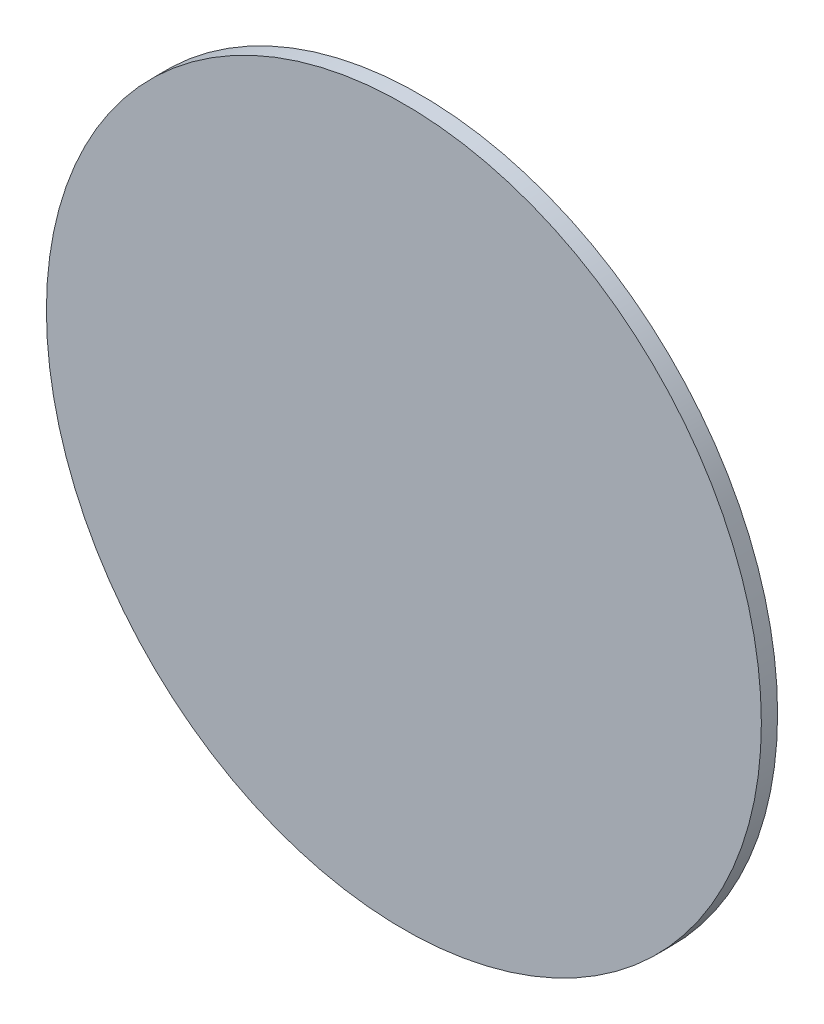
ISO-10303-21;
HEADER;
FILE_DESCRIPTION(('STEP AP214'),'2;1');
FILE_NAME('part.step','',(''),(''),'','','');
FILE_SCHEMA(('AUTOMOTIVE_DESIGN { 1 0 10303 214 1 1 1 1 }'));
ENDSEC;
DATA;
#1=APPLICATION_CONTEXT('core data for automotive mechanical design processes');
#2=APPLICATION_PROTOCOL_DEFINITION('international standard','automotive_design',2000,#1);
#3=PRODUCT_CONTEXT('',#1,'mechanical');
#4=PRODUCT('Part','Part','',(#3));
#5=PRODUCT_RELATED_PRODUCT_CATEGORY('part','',(#4));
#6=PRODUCT_DEFINITION_FORMATION('','',#4);
#7=PRODUCT_DEFINITION_CONTEXT('part definition',#1,'design');
#8=PRODUCT_DEFINITION('design','',#6,#7);
#9=PRODUCT_DEFINITION_SHAPE('','',#8);
#10=(LENGTH_UNIT() NAMED_UNIT(*) SI_UNIT(.MILLI.,.METRE.));
#11=(NAMED_UNIT(*) PLANE_ANGLE_UNIT() SI_UNIT($,.RADIAN.));
#12=(NAMED_UNIT(*) SI_UNIT($,.STERADIAN.) SOLID_ANGLE_UNIT());
#13=UNCERTAINTY_MEASURE_WITH_UNIT(LENGTH_MEASURE(1.E-05),#10,'distance_accuracy_value','');
#14=(GEOMETRIC_REPRESENTATION_CONTEXT(3) GLOBAL_UNCERTAINTY_ASSIGNED_CONTEXT((#13)) GLOBAL_UNIT_ASSIGNED_CONTEXT((#10,
#11,#12)) REPRESENTATION_CONTEXT('',''));
#15=CARTESIAN_POINT('',(0.,0.,0.));
#16=DIRECTION('',(0.,0.,1.));
#17=DIRECTION('',(1.,0.,0.));
#18=AXIS2_PLACEMENT_3D('',#15,#16,#17);
#19=CARTESIAN_POINT('',(0.,0.,1.));
#20=DIRECTION('',(0.,0.,-1.));
#21=DIRECTION('',(-1.,0.,0.));
#22=AXIS2_PLACEMENT_3D('',#19,#20,#21);
#23=CYLINDRICAL_SURFACE('',#22,22.025);
#24=CARTESIAN_POINT('',(0.,0.,1.));
#25=DIRECTION('',(0.,0.,1.));
#26=DIRECTION('',(1.,0.,0.));
#27=AXIS2_PLACEMENT_3D('',#24,#25,#26);
#28=CIRCLE('',#27,22.025);
#29=CARTESIAN_POINT('',(22.025,0.,1.));
#30=VERTEX_POINT('',#29);
#31=EDGE_CURVE('E10',#30,#30,#28,.T.);
#32=ORIENTED_EDGE('',*,*,#31,.F.);
#33=EDGE_LOOP('',(#32));
#34=FACE_BOUND('',#33,.T.);
#35=CARTESIAN_POINT('',(0.,0.,0.));
#36=DIRECTION('',(0.,0.,1.));
#37=DIRECTION('',(1.,0.,0.));
#38=AXIS2_PLACEMENT_3D('',#35,#36,#37);
#39=CIRCLE('',#38,22.025);
#40=CARTESIAN_POINT('',(22.025,0.,0.));
#41=VERTEX_POINT('',#40);
#42=EDGE_CURVE('E33',#41,#41,#39,.T.);
#43=ORIENTED_EDGE('',*,*,#42,.T.);
#44=EDGE_LOOP('',(#43));
#45=FACE_BOUND('',#44,.T.);
#46=ADVANCED_FACE('F30',(#34,#45),#23,.T.);
#47=CARTESIAN_POINT('',(0.,0.,1.));
#48=DIRECTION('',(0.,0.,1.));
#49=DIRECTION('',(1.,0.,0.));
#50=AXIS2_PLACEMENT_3D('',#47,#48,#49);
#51=PLANE('',#50);
#52=ORIENTED_EDGE('',*,*,#31,.T.);
#53=EDGE_LOOP('',(#52));
#54=FACE_BOUND('',#53,.T.);
#55=ADVANCED_FACE('F45',(#54),#51,.T.);
#56=CARTESIAN_POINT('',(0.,0.,0.));
#57=DIRECTION('',(0.,0.,1.));
#58=DIRECTION('',(1.,0.,0.));
#59=AXIS2_PLACEMENT_3D('',#56,#57,#58);
#60=PLANE('',#59);
#61=ORIENTED_EDGE('',*,*,#42,.F.);
#62=EDGE_LOOP('',(#61));
#63=FACE_BOUND('',#62,.T.);
#64=ADVANCED_FACE('F43',(#63),#60,.F.);
#65=CLOSED_SHELL('',(#46,#55,#64));
#66=MANIFOLD_SOLID_BREP('B2',#65);
#67=ADVANCED_BREP_SHAPE_REPRESENTATION('',(#18,#66),#14);
#68=SHAPE_DEFINITION_REPRESENTATION(#9,#67);
ENDSEC;
END-ISO-10303-21;
